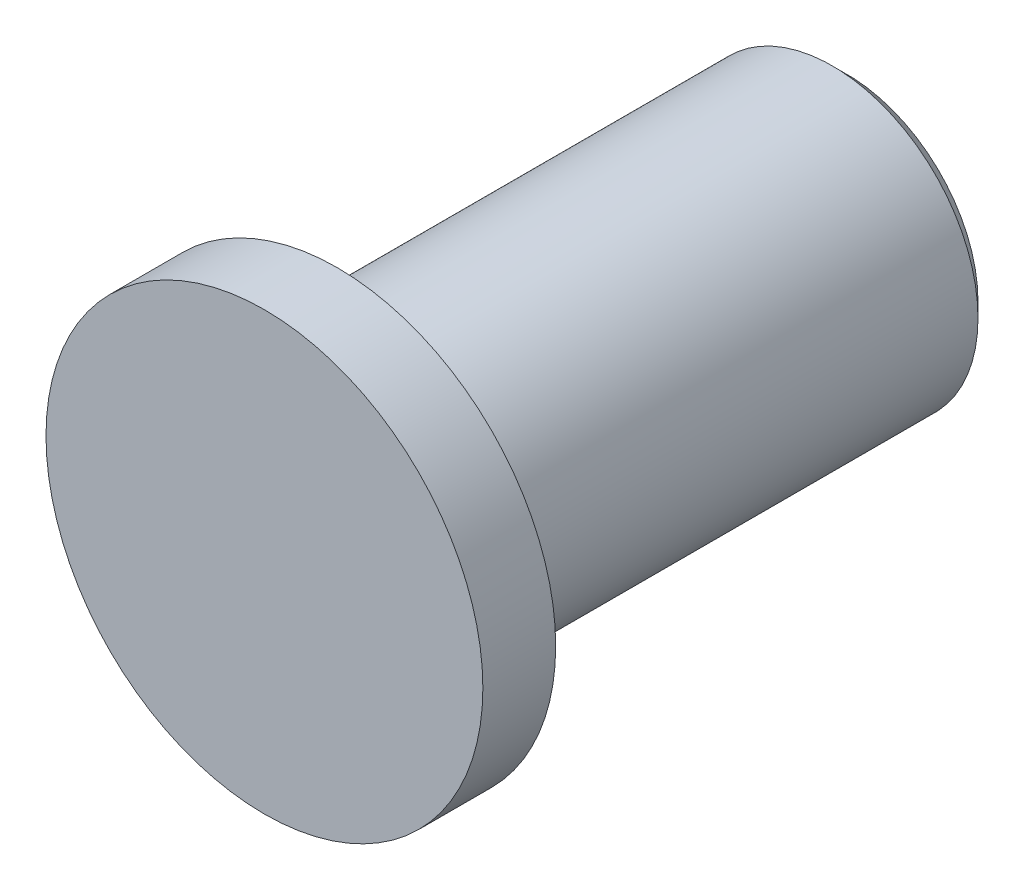
ISO-10303-21;
HEADER;
FILE_DESCRIPTION(('STEP AP214'),'2;1');
FILE_NAME('part.step','',(''),(''),'','','');
FILE_SCHEMA(('AUTOMOTIVE_DESIGN { 1 0 10303 214 1 1 1 1 }'));
ENDSEC;
DATA;
#1=APPLICATION_CONTEXT('core data for automotive mechanical design processes');
#2=APPLICATION_PROTOCOL_DEFINITION('international standard','automotive_design',2000,#1);
#3=PRODUCT_CONTEXT('',#1,'mechanical');
#4=PRODUCT('Part','Part','',(#3));
#5=PRODUCT_RELATED_PRODUCT_CATEGORY('part','',(#4));
#6=PRODUCT_DEFINITION_FORMATION('','',#4);
#7=PRODUCT_DEFINITION_CONTEXT('part definition',#1,'design');
#8=PRODUCT_DEFINITION('design','',#6,#7);
#9=PRODUCT_DEFINITION_SHAPE('','',#8);
#10=(LENGTH_UNIT() NAMED_UNIT(*) SI_UNIT(.MILLI.,.METRE.));
#11=(NAMED_UNIT(*) PLANE_ANGLE_UNIT() SI_UNIT($,.RADIAN.));
#12=(NAMED_UNIT(*) SI_UNIT($,.STERADIAN.) SOLID_ANGLE_UNIT());
#13=UNCERTAINTY_MEASURE_WITH_UNIT(LENGTH_MEASURE(1.E-05),#10,'distance_accuracy_value','');
#14=(GEOMETRIC_REPRESENTATION_CONTEXT(3) GLOBAL_UNCERTAINTY_ASSIGNED_CONTEXT((#13)) GLOBAL_UNIT_ASSIGNED_CONTEXT((#10,
#11,#12)) REPRESENTATION_CONTEXT('',''));
#15=CARTESIAN_POINT('',(0.,0.,0.));
#16=DIRECTION('',(0.,0.,1.));
#17=DIRECTION('',(1.,0.,0.));
#18=AXIS2_PLACEMENT_3D('',#15,#16,#17);
#19=CARTESIAN_POINT('',(0.,0.,-35.));
#20=DIRECTION('',(0.,0.,1.));
#21=DIRECTION('',(1.,0.,0.));
#22=AXIS2_PLACEMENT_3D('',#19,#20,#21);
#23=CYLINDRICAL_SURFACE('',#22,10.);
#24=CARTESIAN_POINT('',(0.,0.,-34.));
#25=DIRECTION('',(0.,0.,1.));
#26=DIRECTION('',(1.,0.,0.));
#27=AXIS2_PLACEMENT_3D('',#24,#25,#26);
#28=CIRCLE('',#27,10.);
#29=CARTESIAN_POINT('',(10.,0.,-34.));
#30=VERTEX_POINT('',#29);
#31=EDGE_CURVE('E48',#30,#30,#28,.T.);
#32=ORIENTED_EDGE('',*,*,#31,.T.);
#33=EDGE_LOOP('',(#32));
#34=FACE_BOUND('',#33,.T.);
#35=CARTESIAN_POINT('',(0.,0.,0.));
#36=DIRECTION('',(0.,0.,1.));
#37=DIRECTION('',(1.,0.,0.));
#38=AXIS2_PLACEMENT_3D('',#35,#36,#37);
#39=CIRCLE('',#38,10.);
#40=CARTESIAN_POINT('',(10.,0.,0.));
#41=VERTEX_POINT('',#40);
#42=EDGE_CURVE('E53',#41,#41,#39,.T.);
#43=ORIENTED_EDGE('',*,*,#42,.F.);
#44=EDGE_LOOP('',(#43));
#45=FACE_BOUND('',#44,.T.);
#46=ADVANCED_FACE('F39',(#34,#45),#23,.T.);
#47=CARTESIAN_POINT('',(0.,0.,-35.));
#48=DIRECTION('',(0.,0.,1.));
#49=DIRECTION('',(1.,0.,0.));
#50=AXIS2_PLACEMENT_3D('',#47,#48,#49);
#51=PLANE('',#50);
#52=CARTESIAN_POINT('',(0.,0.,-35.));
#53=DIRECTION('',(0.,0.,1.));
#54=DIRECTION('',(1.,0.,0.));
#55=AXIS2_PLACEMENT_3D('',#52,#53,#54);
#56=CIRCLE('',#55,8.99999999999999);
#57=CARTESIAN_POINT('',(8.99999999999999,0.,-35.));
#58=VERTEX_POINT('',#57);
#59=EDGE_CURVE('E10',#58,#58,#56,.F.);
#60=ORIENTED_EDGE('',*,*,#59,.T.);
#61=EDGE_LOOP('',(#60));
#62=FACE_BOUND('',#61,.T.);
#63=ADVANCED_FACE('F74',(#62),#51,.F.);
#64=CARTESIAN_POINT('',(0.,0.,5.));
#65=DIRECTION('',(0.,0.,-1.));
#66=DIRECTION('',(-1.,0.,0.));
#67=AXIS2_PLACEMENT_3D('',#64,#65,#66);
#68=CYLINDRICAL_SURFACE('',#67,15.);
#69=CARTESIAN_POINT('',(0.,0.,5.));
#70=DIRECTION('',(0.,0.,1.));
#71=DIRECTION('',(1.,0.,0.));
#72=AXIS2_PLACEMENT_3D('',#69,#70,#71);
#73=CIRCLE('',#72,15.);
#74=CARTESIAN_POINT('',(15.,0.,5.));
#75=VERTEX_POINT('',#74);
#76=EDGE_CURVE('E58',#75,#75,#73,.T.);
#77=ORIENTED_EDGE('',*,*,#76,.F.);
#78=EDGE_LOOP('',(#77));
#79=FACE_BOUND('',#78,.T.);
#80=CARTESIAN_POINT('',(0.,0.,0.));
#81=DIRECTION('',(0.,0.,1.));
#82=DIRECTION('',(1.,0.,0.));
#83=AXIS2_PLACEMENT_3D('',#80,#81,#82);
#84=CIRCLE('',#83,15.);
#85=CARTESIAN_POINT('',(15.,0.,0.));
#86=VERTEX_POINT('',#85);
#87=EDGE_CURVE('E61',#86,#86,#84,.T.);
#88=ORIENTED_EDGE('',*,*,#87,.T.);
#89=EDGE_LOOP('',(#88));
#90=FACE_BOUND('',#89,.T.);
#91=ADVANCED_FACE('F71',(#79,#90),#68,.T.);
#92=CARTESIAN_POINT('',(0.,0.,5.));
#93=DIRECTION('',(0.,0.,1.));
#94=DIRECTION('',(1.,0.,0.));
#95=AXIS2_PLACEMENT_3D('',#92,#93,#94);
#96=PLANE('',#95);
#97=ORIENTED_EDGE('',*,*,#76,.T.);
#98=EDGE_LOOP('',(#97));
#99=FACE_BOUND('',#98,.T.);
#100=ADVANCED_FACE('F69',(#99),#96,.T.);
#101=CARTESIAN_POINT('',(0.,0.,0.));
#102=DIRECTION('',(0.,0.,1.));
#103=DIRECTION('',(1.,0.,0.));
#104=AXIS2_PLACEMENT_3D('',#101,#102,#103);
#105=PLANE('',#104);
#106=ORIENTED_EDGE('',*,*,#42,.T.);
#107=EDGE_LOOP('',(#106));
#108=FACE_BOUND('',#107,.T.);
#109=ORIENTED_EDGE('',*,*,#87,.F.);
#110=EDGE_LOOP('',(#109));
#111=FACE_BOUND('',#110,.T.);
#112=ADVANCED_FACE('F78',(#108,#111),#105,.F.);
#113=CARTESIAN_POINT('',(0.,0.,-34.));
#114=DIRECTION('',(0.,0.,1.));
#115=DIRECTION('',(1.,0.,0.));
#116=AXIS2_PLACEMENT_3D('',#113,#114,#115);
#117=CONICAL_SURFACE('',#116,10.,0.785398163397451);
#118=ORIENTED_EDGE('',*,*,#59,.F.);
#119=EDGE_LOOP('',(#118));
#120=FACE_BOUND('',#119,.T.);
#121=ORIENTED_EDGE('',*,*,#31,.F.);
#122=EDGE_LOOP('',(#121));
#123=FACE_BOUND('',#122,.T.);
#124=ADVANCED_FACE('F42',(#120,#123),#117,.T.);
#125=CLOSED_SHELL('',(#46,#63,#91,#100,#112,#124));
#126=MANIFOLD_SOLID_BREP('B2',#125);
#127=ADVANCED_BREP_SHAPE_REPRESENTATION('',(#18,#126),#14);
#128=SHAPE_DEFINITION_REPRESENTATION(#9,#127);
ENDSEC;
END-ISO-10303-21;
